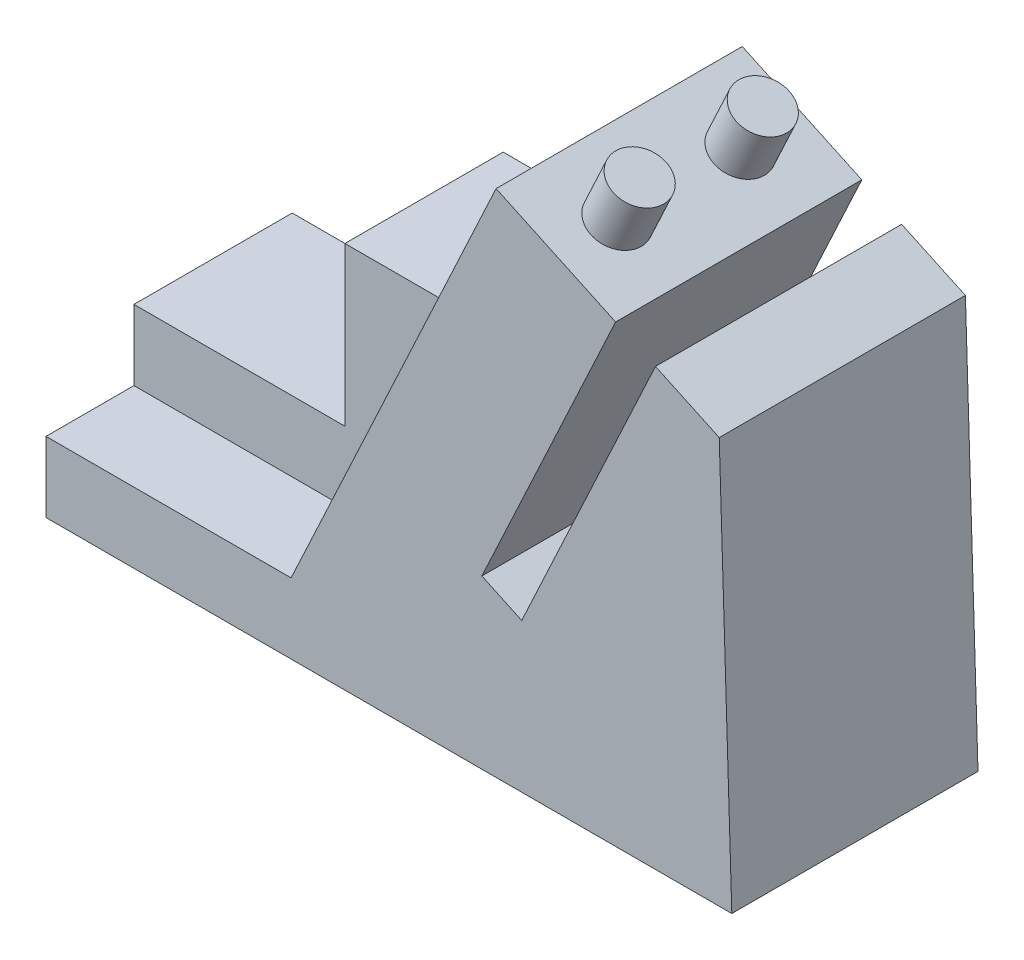
ISO-10303-21;
HEADER;
FILE_DESCRIPTION(('STEP AP214'),'2;1');
FILE_NAME('part.step','',(''),(''),'','','');
FILE_SCHEMA(('AUTOMOTIVE_DESIGN { 1 0 10303 214 1 1 1 1 }'));
ENDSEC;
DATA;
#1=APPLICATION_CONTEXT('core data for automotive mechanical design processes');
#2=APPLICATION_PROTOCOL_DEFINITION('international standard','automotive_design',2000,#1);
#3=PRODUCT_CONTEXT('',#1,'mechanical');
#4=PRODUCT('Part','Part','',(#3));
#5=PRODUCT_RELATED_PRODUCT_CATEGORY('part','',(#4));
#6=PRODUCT_DEFINITION_FORMATION('','',#4);
#7=PRODUCT_DEFINITION_CONTEXT('part definition',#1,'design');
#8=PRODUCT_DEFINITION('design','',#6,#7);
#9=PRODUCT_DEFINITION_SHAPE('','',#8);
#10=(LENGTH_UNIT() NAMED_UNIT(*) SI_UNIT(.MILLI.,.METRE.));
#11=(NAMED_UNIT(*) PLANE_ANGLE_UNIT() SI_UNIT($,.RADIAN.));
#12=(NAMED_UNIT(*) SI_UNIT($,.STERADIAN.) SOLID_ANGLE_UNIT());
#13=UNCERTAINTY_MEASURE_WITH_UNIT(LENGTH_MEASURE(1.E-05),#10,'distance_accuracy_value','');
#14=(GEOMETRIC_REPRESENTATION_CONTEXT(3) GLOBAL_UNCERTAINTY_ASSIGNED_CONTEXT((#13)) GLOBAL_UNIT_ASSIGNED_CONTEXT((#10,
#11,#12)) REPRESENTATION_CONTEXT('',''));
#15=CARTESIAN_POINT('',(0.,0.,0.));
#16=DIRECTION('',(0.,0.,1.));
#17=DIRECTION('',(1.,0.,0.));
#18=AXIS2_PLACEMENT_3D('',#15,#16,#17);
#19=CARTESIAN_POINT('',(27.8760008879699,8.,28.));
#20=DIRECTION('',(0.,-1.,0.));
#21=DIRECTION('',(1.,0.,0.));
#22=AXIS2_PLACEMENT_3D('',#19,#20,#21);
#23=PLANE('',#22);
#24=DIRECTION('',(0.,0.,-1.));
#25=VECTOR('',#24,1.);
#26=CARTESIAN_POINT('',(27.8760008879699,8.,28.));
#27=LINE('',#26,#25);
#28=CARTESIAN_POINT('',(27.8760008879699,8.,28.));
#29=VERTEX_POINT('',#28);
#30=CARTESIAN_POINT('',(27.8760008879699,8.,18.));
#31=VERTEX_POINT('',#30);
#32=EDGE_CURVE('E213',#29,#31,#27,.T.);
#33=ORIENTED_EDGE('',*,*,#32,.T.);
#34=DIRECTION('',(-1.,0.,0.));
#35=VECTOR('',#34,1.);
#36=CARTESIAN_POINT('',(0.,8.,18.));
#37=LINE('',#36,#35);
#38=CARTESIAN_POINT('',(0.,8.,18.));
#39=VERTEX_POINT('',#38);
#40=EDGE_CURVE('E59',#31,#39,#37,.T.);
#41=ORIENTED_EDGE('',*,*,#40,.T.);
#42=DIRECTION('',(0.,0.,-1.));
#43=VECTOR('',#42,1.);
#44=CARTESIAN_POINT('',(0.,8.,28.));
#45=LINE('',#44,#43);
#46=CARTESIAN_POINT('',(0.,8.,28.));
#47=VERTEX_POINT('',#46);
#48=EDGE_CURVE('E255',#47,#39,#45,.T.);
#49=ORIENTED_EDGE('',*,*,#48,.F.);
#50=DIRECTION('',(-1.,0.,0.));
#51=VECTOR('',#50,1.);
#52=CARTESIAN_POINT('',(27.8760008879699,8.,28.));
#53=LINE('',#52,#51);
#54=EDGE_CURVE('E191',#29,#47,#53,.T.);
#55=ORIENTED_EDGE('',*,*,#54,.F.);
#56=EDGE_LOOP('',(#33,#41,#49,#55));
#57=FACE_BOUND('',#56,.T.);
#58=ADVANCED_FACE('F45',(#57),#23,.F.);
#59=CARTESIAN_POINT('',(0.,8.,28.));
#60=DIRECTION('',(1.,0.,0.));
#61=DIRECTION('',(0.,0.,-1.));
#62=AXIS2_PLACEMENT_3D('',#59,#60,#61);
#63=PLANE('',#62);
#64=DIRECTION('',(0.,-1.,0.));
#65=VECTOR('',#64,1.);
#66=CARTESIAN_POINT('',(0.,8.,0.));
#67=LINE('',#66,#65);
#68=CARTESIAN_POINT('',(0.,16.,0.));
#69=VERTEX_POINT('',#68);
#70=CARTESIAN_POINT('',(0.,0.,0.));
#71=VERTEX_POINT('',#70);
#72=EDGE_CURVE('E157',#69,#71,#67,.T.);
#73=ORIENTED_EDGE('',*,*,#72,.T.);
#74=DIRECTION('',(0.,0.,-1.));
#75=VECTOR('',#74,1.);
#76=CARTESIAN_POINT('',(0.,0.,28.));
#77=LINE('',#76,#75);
#78=CARTESIAN_POINT('',(0.,0.,28.));
#79=VERTEX_POINT('',#78);
#80=EDGE_CURVE('E252',#79,#71,#77,.T.);
#81=ORIENTED_EDGE('',*,*,#80,.F.);
#82=DIRECTION('',(0.,-1.,0.));
#83=VECTOR('',#82,1.);
#84=CARTESIAN_POINT('',(0.,8.,28.));
#85=LINE('',#84,#83);
#86=EDGE_CURVE('E194',#47,#79,#85,.T.);
#87=ORIENTED_EDGE('',*,*,#86,.F.);
#88=ORIENTED_EDGE('',*,*,#48,.T.);
#89=DIRECTION('',(0.,1.,0.));
#90=VECTOR('',#89,1.);
#91=CARTESIAN_POINT('',(0.,0.,18.));
#92=LINE('',#91,#90);
#93=CARTESIAN_POINT('',(0.,16.,18.));
#94=VERTEX_POINT('',#93);
#95=EDGE_CURVE('E172',#39,#94,#92,.T.);
#96=ORIENTED_EDGE('',*,*,#95,.T.);
#97=DIRECTION('',(0.,0.,-1.));
#98=VECTOR('',#97,1.);
#99=CARTESIAN_POINT('',(0.,16.,18.));
#100=LINE('',#99,#98);
#101=EDGE_CURVE('E187',#94,#69,#100,.T.);
#102=ORIENTED_EDGE('',*,*,#101,.T.);
#103=EDGE_LOOP('',(#73,#81,#87,#88,#96,#102));
#104=FACE_BOUND('',#103,.T.);
#105=ADVANCED_FACE('F284',(#104),#63,.F.);
#106=CARTESIAN_POINT('',(0.,0.,28.));
#107=DIRECTION('',(0.,1.,0.));
#108=DIRECTION('',(0.,0.,1.));
#109=AXIS2_PLACEMENT_3D('',#106,#107,#108);
#110=PLANE('',#109);
#111=DIRECTION('',(1.,0.,0.));
#112=VECTOR('',#111,1.);
#113=CARTESIAN_POINT('',(0.,0.,0.));
#114=LINE('',#113,#112);
#115=CARTESIAN_POINT('',(78.,0.,0.));
#116=VERTEX_POINT('',#115);
#117=EDGE_CURVE('E215',#71,#116,#114,.T.);
#118=ORIENTED_EDGE('',*,*,#117,.T.);
#119=DIRECTION('',(0.,0.,-1.));
#120=VECTOR('',#119,1.);
#121=CARTESIAN_POINT('',(78.,0.,28.));
#122=LINE('',#121,#120);
#123=CARTESIAN_POINT('',(78.,0.,28.));
#124=VERTEX_POINT('',#123);
#125=EDGE_CURVE('E249',#124,#116,#122,.T.);
#126=ORIENTED_EDGE('',*,*,#125,.F.);
#127=DIRECTION('',(1.,0.,0.));
#128=VECTOR('',#127,1.);
#129=CARTESIAN_POINT('',(0.,0.,28.));
#130=LINE('',#129,#128);
#131=EDGE_CURVE('E197',#79,#124,#130,.T.);
#132=ORIENTED_EDGE('',*,*,#131,.F.);
#133=ORIENTED_EDGE('',*,*,#80,.T.);
#134=EDGE_LOOP('',(#118,#126,#132,#133));
#135=FACE_BOUND('',#134,.T.);
#136=ADVANCED_FACE('F314',(#135),#110,.F.);
#137=CARTESIAN_POINT('',(78.,0.,28.));
#138=DIRECTION('',(-0.999519288807426,-0.03100308536094,0.));
#139=DIRECTION('',(0.03100308536094,-0.999519288807426,0.));
#140=AXIS2_PLACEMENT_3D('',#137,#138,#139);
#141=PLANE('',#140);
#142=DIRECTION('',(-0.03100308536094,0.999519288807426,0.));
#143=VECTOR('',#142,1.);
#144=CARTESIAN_POINT('',(78.,0.,0.));
#145=LINE('',#144,#143);
#146=CARTESIAN_POINT('',(76.5680018327462,46.1666886712603,0.));
#147=VERTEX_POINT('',#146);
#148=EDGE_CURVE('E217',#116,#147,#145,.T.);
#149=ORIENTED_EDGE('',*,*,#148,.T.);
#150=DIRECTION('',(0.,0.,-1.));
#151=VECTOR('',#150,1.);
#152=CARTESIAN_POINT('',(76.5680018327462,46.1666886712603,28.));
#153=LINE('',#152,#151);
#154=CARTESIAN_POINT('',(76.5680018327462,46.1666886712603,28.));
#155=VERTEX_POINT('',#154);
#156=EDGE_CURVE('E246',#155,#147,#153,.T.);
#157=ORIENTED_EDGE('',*,*,#156,.F.);
#158=DIRECTION('',(-0.03100308536094,0.999519288807426,0.));
#159=VECTOR('',#158,1.);
#160=CARTESIAN_POINT('',(78.,0.,28.));
#161=LINE('',#160,#159);
#162=EDGE_CURVE('E199',#124,#155,#161,.T.);
#163=ORIENTED_EDGE('',*,*,#162,.F.);
#164=ORIENTED_EDGE('',*,*,#125,.T.);
#165=EDGE_LOOP('',(#149,#157,#163,#164));
#166=FACE_BOUND('',#165,.T.);
#167=ADVANCED_FACE('F309',(#166),#141,.F.);
#168=CARTESIAN_POINT('',(76.5680018327462,46.1666886712603,28.));
#169=DIRECTION('',(-0.422618261740703,-0.906307787036648,0.));
#170=DIRECTION('',(0.906307787036648,-0.422618261740703,0.));
#171=AXIS2_PLACEMENT_3D('',#168,#169,#170);
#172=PLANE('',#171);
#173=DIRECTION('',(-0.906307787036648,0.422618261740703,0.));
#174=VECTOR('',#173,1.);
#175=CARTESIAN_POINT('',(76.5680018327462,46.1666886712603,0.));
#176=LINE('',#175,#174);
#177=CARTESIAN_POINT('',(69.3175395364531,49.5476347651859,0.));
#178=VERTEX_POINT('',#177);
#179=EDGE_CURVE('E219',#147,#178,#176,.T.);
#180=ORIENTED_EDGE('',*,*,#179,.T.);
#181=DIRECTION('',(0.,0.,-1.));
#182=VECTOR('',#181,1.);
#183=CARTESIAN_POINT('',(69.3175395364531,49.5476347651859,28.));
#184=LINE('',#183,#182);
#185=CARTESIAN_POINT('',(69.3175395364531,49.5476347651859,28.));
#186=VERTEX_POINT('',#185);
#187=EDGE_CURVE('E243',#186,#178,#184,.T.);
#188=ORIENTED_EDGE('',*,*,#187,.F.);
#189=DIRECTION('',(-0.906307787036648,0.422618261740703,0.));
#190=VECTOR('',#189,1.);
#191=CARTESIAN_POINT('',(76.5680018327462,46.1666886712603,28.));
#192=LINE('',#191,#190);
#193=EDGE_CURVE('E201',#155,#186,#192,.T.);
#194=ORIENTED_EDGE('',*,*,#193,.F.);
#195=ORIENTED_EDGE('',*,*,#156,.T.);
#196=EDGE_LOOP('',(#180,#188,#194,#195));
#197=FACE_BOUND('',#196,.T.);
#198=ADVANCED_FACE('F305',(#197),#172,.F.);
#199=CARTESIAN_POINT('',(69.3175395364531,49.5476347651859,28.));
#200=DIRECTION('',(0.906307787036648,-0.422618261740704,0.));
#201=DIRECTION('',(0.422618261740704,0.906307787036648,0.));
#202=AXIS2_PLACEMENT_3D('',#199,#200,#201);
#203=PLANE('',#202);
#204=DIRECTION('',(-0.422618261740704,-0.906307787036648,0.));
#205=VECTOR('',#204,1.);
#206=CARTESIAN_POINT('',(69.3175395364531,49.5476347651859,0.));
#207=LINE('',#206,#205);
#208=CARTESIAN_POINT('',(54.1032821137877,16.9205544318666,0.));
#209=VERTEX_POINT('',#208);
#210=EDGE_CURVE('E221',#178,#209,#207,.T.);
#211=ORIENTED_EDGE('',*,*,#210,.T.);
#212=DIRECTION('',(0.,0.,-1.));
#213=VECTOR('',#212,1.);
#214=CARTESIAN_POINT('',(54.1032821137877,16.9205544318666,28.));
#215=LINE('',#214,#213);
#216=CARTESIAN_POINT('',(54.1032821137877,16.9205544318666,28.));
#217=VERTEX_POINT('',#216);
#218=EDGE_CURVE('E240',#217,#209,#215,.T.);
#219=ORIENTED_EDGE('',*,*,#218,.F.);
#220=DIRECTION('',(-0.422618261740704,-0.906307787036648,0.));
#221=VECTOR('',#220,1.);
#222=CARTESIAN_POINT('',(69.3175395364531,49.5476347651859,28.));
#223=LINE('',#222,#221);
#224=EDGE_CURVE('E203',#186,#217,#223,.T.);
#225=ORIENTED_EDGE('',*,*,#224,.F.);
#226=ORIENTED_EDGE('',*,*,#187,.T.);
#227=EDGE_LOOP('',(#211,#219,#225,#226));
#228=FACE_BOUND('',#227,.T.);
#229=ADVANCED_FACE('F301',(#228),#203,.F.);
#230=CARTESIAN_POINT('',(54.1032821137877,16.9205544318666,28.));
#231=DIRECTION('',(-0.422618261740704,-0.906307787036648,0.));
#232=DIRECTION('',(0.906307787036648,-0.422618261740704,0.));
#233=AXIS2_PLACEMENT_3D('',#230,#231,#232);
#234=PLANE('',#233);
#235=DIRECTION('',(-0.906307787036648,0.422618261740704,0.));
#236=VECTOR('',#235,1.);
#237=CARTESIAN_POINT('',(54.1032821137877,16.9205544318666,0.));
#238=LINE('',#237,#236);
#239=CARTESIAN_POINT('',(49.5717431786045,19.0336457405701,0.));
#240=VERTEX_POINT('',#239);
#241=EDGE_CURVE('E223',#209,#240,#238,.T.);
#242=ORIENTED_EDGE('',*,*,#241,.T.);
#243=DIRECTION('',(0.,0.,-1.));
#244=VECTOR('',#243,1.);
#245=CARTESIAN_POINT('',(49.5717431786045,19.0336457405701,28.));
#246=LINE('',#245,#244);
#247=CARTESIAN_POINT('',(49.5717431786045,19.0336457405701,28.));
#248=VERTEX_POINT('',#247);
#249=EDGE_CURVE('E237',#248,#240,#246,.T.);
#250=ORIENTED_EDGE('',*,*,#249,.F.);
#251=DIRECTION('',(-0.906307787036648,0.422618261740704,0.));
#252=VECTOR('',#251,1.);
#253=CARTESIAN_POINT('',(54.1032821137877,16.9205544318666,28.));
#254=LINE('',#253,#252);
#255=EDGE_CURVE('E205',#217,#248,#254,.T.);
#256=ORIENTED_EDGE('',*,*,#255,.F.);
#257=ORIENTED_EDGE('',*,*,#218,.T.);
#258=EDGE_LOOP('',(#242,#250,#256,#257));
#259=FACE_BOUND('',#258,.T.);
#260=ADVANCED_FACE('F297',(#259),#234,.F.);
#261=CARTESIAN_POINT('',(49.5717431786045,19.0336457405701,28.));
#262=DIRECTION('',(-0.906307787036648,0.422618261740703,0.));
#263=DIRECTION('',(-0.422618261740703,-0.906307787036648,0.));
#264=AXIS2_PLACEMENT_3D('',#261,#262,#263);
#265=PLANE('',#264);
#266=DIRECTION('',(0.422618261740703,0.906307787036648,0.));
#267=VECTOR('',#266,1.);
#268=CARTESIAN_POINT('',(49.5717431786045,19.0336457405701,0.));
#269=LINE('',#268,#267);
#270=CARTESIAN_POINT('',(64.7860006012698,51.6607260738894,0.));
#271=VERTEX_POINT('',#270);
#272=EDGE_CURVE('E225',#240,#271,#269,.T.);
#273=ORIENTED_EDGE('',*,*,#272,.T.);
#274=DIRECTION('',(0.,0.,-1.));
#275=VECTOR('',#274,1.);
#276=CARTESIAN_POINT('',(64.7860006012698,51.6607260738894,28.));
#277=LINE('',#276,#275);
#278=CARTESIAN_POINT('',(64.7860006012698,51.6607260738894,28.));
#279=VERTEX_POINT('',#278);
#280=EDGE_CURVE('E234',#279,#271,#277,.T.);
#281=ORIENTED_EDGE('',*,*,#280,.F.);
#282=DIRECTION('',(0.422618261740703,0.906307787036648,0.));
#283=VECTOR('',#282,1.);
#284=CARTESIAN_POINT('',(49.5717431786045,19.0336457405701,28.));
#285=LINE('',#284,#283);
#286=EDGE_CURVE('E207',#248,#279,#285,.T.);
#287=ORIENTED_EDGE('',*,*,#286,.F.);
#288=ORIENTED_EDGE('',*,*,#249,.T.);
#289=EDGE_LOOP('',(#273,#281,#287,#288));
#290=FACE_BOUND('',#289,.T.);
#291=ADVANCED_FACE('F265',(#290),#265,.F.);
#292=CARTESIAN_POINT('',(64.7860006012698,51.6607260738894,28.));
#293=DIRECTION('',(-0.422618261740704,-0.906307787036648,0.));
#294=DIRECTION('',(0.906307787036648,-0.422618261740704,0.));
#295=AXIS2_PLACEMENT_3D('',#292,#293,#294);
#296=PLANE('',#295);
#297=CARTESIAN_POINT('',(57.988692198495,54.8303630369447,21.));
#298=DIRECTION('',(-0.422618261740704,-0.906307787036648,0.));
#299=DIRECTION('',(0.906307787036648,-0.422618261740704,0.));
#300=AXIS2_PLACEMENT_3D('',#297,#298,#299);
#301=CIRCLE('',#300,3.);
#302=CARTESIAN_POINT('',(60.707615559605,53.5625082517226,21.));
#303=VERTEX_POINT('',#302);
#304=EDGE_CURVE('E11',#303,#303,#301,.F.);
#305=ORIENTED_EDGE('',*,*,#304,.F.);
#306=EDGE_LOOP('',(#305));
#307=FACE_BOUND('',#306,.T.);
#308=CARTESIAN_POINT('',(57.988692198495,54.8303630369447,7.));
#309=DIRECTION('',(-0.422618261740704,-0.906307787036648,0.));
#310=DIRECTION('',(0.906307787036648,-0.422618261740704,0.));
#311=AXIS2_PLACEMENT_3D('',#308,#309,#310);
#312=CIRCLE('',#311,3.);
#313=CARTESIAN_POINT('',(60.707615559605,53.5625082517226,7.));
#314=VERTEX_POINT('',#313);
#315=EDGE_CURVE('E52',#314,#314,#312,.F.);
#316=ORIENTED_EDGE('',*,*,#315,.F.);
#317=EDGE_LOOP('',(#316));
#318=FACE_BOUND('',#317,.T.);
#319=DIRECTION('',(-0.906307787036648,0.422618261740704,0.));
#320=VECTOR('',#319,1.);
#321=CARTESIAN_POINT('',(64.7860006012698,51.6607260738894,0.));
#322=LINE('',#321,#320);
#323=CARTESIAN_POINT('',(51.1913837957201,58.,0.));
#324=VERTEX_POINT('',#323);
#325=EDGE_CURVE('E227',#271,#324,#322,.T.);
#326=ORIENTED_EDGE('',*,*,#325,.T.);
#327=DIRECTION('',(0.,0.,-1.));
#328=VECTOR('',#327,1.);
#329=CARTESIAN_POINT('',(51.1913837957201,58.,28.));
#330=LINE('',#329,#328);
#331=CARTESIAN_POINT('',(51.1913837957201,58.,28.));
#332=VERTEX_POINT('',#331);
#333=EDGE_CURVE('E231',#332,#324,#330,.T.);
#334=ORIENTED_EDGE('',*,*,#333,.F.);
#335=DIRECTION('',(-0.906307787036648,0.422618261740704,0.));
#336=VECTOR('',#335,1.);
#337=CARTESIAN_POINT('',(64.7860006012698,51.6607260738894,28.));
#338=LINE('',#337,#336);
#339=EDGE_CURVE('E209',#279,#332,#338,.T.);
#340=ORIENTED_EDGE('',*,*,#339,.F.);
#341=ORIENTED_EDGE('',*,*,#280,.T.);
#342=EDGE_LOOP('',(#326,#334,#340,#341));
#343=FACE_BOUND('',#342,.T.);
#344=ADVANCED_FACE('F261',(#307,#318,#343),#296,.F.);
#345=CARTESIAN_POINT('',(51.1913837957201,58.,28.));
#346=DIRECTION('',(0.906307787036648,-0.422618261740704,0.));
#347=DIRECTION('',(0.422618261740704,0.906307787036648,0.));
#348=AXIS2_PLACEMENT_3D('',#345,#346,#347);
#349=PLANE('',#348);
#350=DIRECTION('',(-0.422618261740704,-0.906307787036648,0.));
#351=VECTOR('',#350,1.);
#352=CARTESIAN_POINT('',(51.1913837957201,58.,0.));
#353=LINE('',#352,#351);
#354=CARTESIAN_POINT('',(40.,34.,0.));
#355=VERTEX_POINT('',#354);
#356=EDGE_CURVE('E195',#324,#355,#353,.T.);
#357=ORIENTED_EDGE('',*,*,#356,.T.);
#358=DIRECTION('',(0.,0.,-1.));
#359=VECTOR('',#358,1.);
#360=CARTESIAN_POINT('',(40.,34.,18.));
#361=LINE('',#360,#359);
#362=CARTESIAN_POINT('',(40.,34.,18.));
#363=VERTEX_POINT('',#362);
#364=EDGE_CURVE('E67',#363,#355,#361,.T.);
#365=ORIENTED_EDGE('',*,*,#364,.F.);
#366=DIRECTION('',(-0.422618261740704,-0.906307787036648,0.));
#367=VECTOR('',#366,1.);
#368=CARTESIAN_POINT('',(19.8329966607079,-9.24827822705073,18.));
#369=LINE('',#368,#367);
#370=EDGE_CURVE('E166',#363,#31,#369,.T.);
#371=ORIENTED_EDGE('',*,*,#370,.T.);
#372=ORIENTED_EDGE('',*,*,#32,.F.);
#373=DIRECTION('',(-0.422618261740704,-0.906307787036648,0.));
#374=VECTOR('',#373,1.);
#375=CARTESIAN_POINT('',(51.1913837957201,58.,28.));
#376=LINE('',#375,#374);
#377=EDGE_CURVE('E211',#332,#29,#376,.T.);
#378=ORIENTED_EDGE('',*,*,#377,.F.);
#379=ORIENTED_EDGE('',*,*,#333,.T.);
#380=EDGE_LOOP('',(#357,#365,#371,#372,#378,#379));
#381=FACE_BOUND('',#380,.T.);
#382=ADVANCED_FACE('F264',(#381),#349,.F.);
#383=CARTESIAN_POINT('',(0.,0.,28.));
#384=DIRECTION('',(0.,0.,1.));
#385=DIRECTION('',(1.,0.,0.));
#386=AXIS2_PLACEMENT_3D('',#383,#384,#385);
#387=PLANE('',#386);
#388=ORIENTED_EDGE('',*,*,#54,.T.);
#389=ORIENTED_EDGE('',*,*,#86,.T.);
#390=ORIENTED_EDGE('',*,*,#131,.T.);
#391=ORIENTED_EDGE('',*,*,#162,.T.);
#392=ORIENTED_EDGE('',*,*,#193,.T.);
#393=ORIENTED_EDGE('',*,*,#224,.T.);
#394=ORIENTED_EDGE('',*,*,#255,.T.);
#395=ORIENTED_EDGE('',*,*,#286,.T.);
#396=ORIENTED_EDGE('',*,*,#339,.T.);
#397=ORIENTED_EDGE('',*,*,#377,.T.);
#398=EDGE_LOOP('',(#388,#389,#390,#391,#392,#393,#394,#395,#396,#397));
#399=FACE_BOUND('',#398,.T.);
#400=ADVANCED_FACE('F288',(#399),#387,.T.);
#401=CARTESIAN_POINT('',(0.,0.,0.));
#402=DIRECTION('',(0.,0.,1.));
#403=DIRECTION('',(1.,0.,0.));
#404=AXIS2_PLACEMENT_3D('',#401,#402,#403);
#405=PLANE('',#404);
#406=ORIENTED_EDGE('',*,*,#72,.F.);
#407=DIRECTION('',(1.,0.,0.));
#408=VECTOR('',#407,1.);
#409=CARTESIAN_POINT('',(0.,16.,0.));
#410=LINE('',#409,#408);
#411=CARTESIAN_POINT('',(24.,16.,0.));
#412=VERTEX_POINT('',#411);
#413=EDGE_CURVE('E167',#69,#412,#410,.T.);
#414=ORIENTED_EDGE('',*,*,#413,.T.);
#415=DIRECTION('',(0.,1.,0.));
#416=VECTOR('',#415,1.);
#417=CARTESIAN_POINT('',(24.,0.,0.));
#418=LINE('',#417,#416);
#419=CARTESIAN_POINT('',(24.,34.,0.));
#420=VERTEX_POINT('',#419);
#421=EDGE_CURVE('E181',#412,#420,#418,.T.);
#422=ORIENTED_EDGE('',*,*,#421,.T.);
#423=DIRECTION('',(1.,0.,0.));
#424=VECTOR('',#423,1.);
#425=CARTESIAN_POINT('',(0.,34.,0.));
#426=LINE('',#425,#424);
#427=EDGE_CURVE('E152',#420,#355,#426,.T.);
#428=ORIENTED_EDGE('',*,*,#427,.T.);
#429=ORIENTED_EDGE('',*,*,#356,.F.);
#430=ORIENTED_EDGE('',*,*,#325,.F.);
#431=ORIENTED_EDGE('',*,*,#272,.F.);
#432=ORIENTED_EDGE('',*,*,#241,.F.);
#433=ORIENTED_EDGE('',*,*,#210,.F.);
#434=ORIENTED_EDGE('',*,*,#179,.F.);
#435=ORIENTED_EDGE('',*,*,#148,.F.);
#436=ORIENTED_EDGE('',*,*,#117,.F.);
#437=EDGE_LOOP('',(#406,#414,#422,#428,#429,#430,#431,#432,#433,#434,#435,#436));
#438=FACE_BOUND('',#437,.T.);
#439=ADVANCED_FACE('F277',(#438),#405,.F.);
#440=CARTESIAN_POINT('',(0.,34.,18.));
#441=DIRECTION('',(0.,1.,0.));
#442=DIRECTION('',(0.,0.,1.));
#443=AXIS2_PLACEMENT_3D('',#440,#441,#442);
#444=PLANE('',#443);
#445=ORIENTED_EDGE('',*,*,#427,.F.);
#446=DIRECTION('',(0.,0.,-1.));
#447=VECTOR('',#446,1.);
#448=CARTESIAN_POINT('',(24.,34.,18.));
#449=LINE('',#448,#447);
#450=CARTESIAN_POINT('',(24.,34.,18.));
#451=VERTEX_POINT('',#450);
#452=EDGE_CURVE('E146',#451,#420,#449,.T.);
#453=ORIENTED_EDGE('',*,*,#452,.F.);
#454=DIRECTION('',(1.,0.,0.));
#455=VECTOR('',#454,1.);
#456=CARTESIAN_POINT('',(0.,34.,18.));
#457=LINE('',#456,#455);
#458=EDGE_CURVE('E149',#451,#363,#457,.T.);
#459=ORIENTED_EDGE('',*,*,#458,.T.);
#460=ORIENTED_EDGE('',*,*,#364,.T.);
#461=EDGE_LOOP('',(#445,#453,#459,#460));
#462=FACE_BOUND('',#461,.T.);
#463=ADVANCED_FACE('F148',(#462),#444,.T.);
#464=CARTESIAN_POINT('',(24.,0.,18.));
#465=DIRECTION('',(-1.,0.,0.));
#466=DIRECTION('',(0.,0.,1.));
#467=AXIS2_PLACEMENT_3D('',#464,#465,#466);
#468=PLANE('',#467);
#469=ORIENTED_EDGE('',*,*,#421,.F.);
#470=DIRECTION('',(0.,0.,-1.));
#471=VECTOR('',#470,1.);
#472=CARTESIAN_POINT('',(24.,16.,18.));
#473=LINE('',#472,#471);
#474=CARTESIAN_POINT('',(24.,16.,18.));
#475=VERTEX_POINT('',#474);
#476=EDGE_CURVE('E158',#475,#412,#473,.T.);
#477=ORIENTED_EDGE('',*,*,#476,.F.);
#478=DIRECTION('',(0.,1.,0.));
#479=VECTOR('',#478,1.);
#480=CARTESIAN_POINT('',(24.,0.,18.));
#481=LINE('',#480,#479);
#482=EDGE_CURVE('E164',#475,#451,#481,.T.);
#483=ORIENTED_EDGE('',*,*,#482,.T.);
#484=ORIENTED_EDGE('',*,*,#452,.T.);
#485=EDGE_LOOP('',(#469,#477,#483,#484));
#486=FACE_BOUND('',#485,.T.);
#487=ADVANCED_FACE('F169',(#486),#468,.T.);
#488=CARTESIAN_POINT('',(0.,16.,18.));
#489=DIRECTION('',(0.,1.,0.));
#490=DIRECTION('',(0.,0.,1.));
#491=AXIS2_PLACEMENT_3D('',#488,#489,#490);
#492=PLANE('',#491);
#493=ORIENTED_EDGE('',*,*,#413,.F.);
#494=ORIENTED_EDGE('',*,*,#101,.F.);
#495=DIRECTION('',(1.,0.,0.));
#496=VECTOR('',#495,1.);
#497=CARTESIAN_POINT('',(0.,16.,18.));
#498=LINE('',#497,#496);
#499=EDGE_CURVE('E170',#94,#475,#498,.T.);
#500=ORIENTED_EDGE('',*,*,#499,.T.);
#501=ORIENTED_EDGE('',*,*,#476,.T.);
#502=EDGE_LOOP('',(#493,#494,#500,#501));
#503=FACE_BOUND('',#502,.T.);
#504=ADVANCED_FACE('F281',(#503),#492,.T.);
#505=CARTESIAN_POINT('',(0.,0.,18.));
#506=DIRECTION('',(0.,0.,1.));
#507=DIRECTION('',(1.,0.,0.));
#508=AXIS2_PLACEMENT_3D('',#505,#506,#507);
#509=PLANE('',#508);
#510=ORIENTED_EDGE('',*,*,#458,.F.);
#511=ORIENTED_EDGE('',*,*,#482,.F.);
#512=ORIENTED_EDGE('',*,*,#499,.F.);
#513=ORIENTED_EDGE('',*,*,#95,.F.);
#514=ORIENTED_EDGE('',*,*,#40,.F.);
#515=ORIENTED_EDGE('',*,*,#370,.F.);
#516=EDGE_LOOP('',(#510,#511,#512,#513,#514,#515));
#517=FACE_BOUND('',#516,.T.);
#518=ADVANCED_FACE('F162',(#517),#509,.T.);
#519=CARTESIAN_POINT('',(60.5244017689393,60.2682097591646,7.));
#520=DIRECTION('',(-0.422618261740703,-0.906307787036648,0.));
#521=DIRECTION('',(0.906307787036648,-0.422618261740703,0.));
#522=AXIS2_PLACEMENT_3D('',#519,#520,#521);
#523=CYLINDRICAL_SURFACE('',#522,3.);
#524=CARTESIAN_POINT('',(60.5244017689393,60.2682097591646,7.));
#525=DIRECTION('',(0.422618261740703,0.906307787036648,0.));
#526=DIRECTION('',(-0.906307787036648,0.422618261740703,0.));
#527=AXIS2_PLACEMENT_3D('',#524,#525,#526);
#528=CIRCLE('',#527,3.);
#529=CARTESIAN_POINT('',(63.2433251300492,59.0003549739425,7.));
#530=VERTEX_POINT('',#529);
#531=EDGE_CURVE('E182',#530,#530,#528,.T.);
#532=CARTESIAN_POINT('',(63.2433251300492,59.0003549739425,7.));
#533=CARTESIAN_POINT('',(63.2169114886904,58.9437107372527,7.));
#534=CARTESIAN_POINT('',(63.1904978473317,58.887066500563,7.));
#535=CARTESIAN_POINT('',(63.1376705646141,58.7737780271834,7.));
#536=CARTESIAN_POINT('',(63.1112569232553,58.7171337904936,7.));
#537=CARTESIAN_POINT('',(63.0584296405377,58.603845317114,7.));
#538=CARTESIAN_POINT('',(63.0320159991789,58.5472010804242,7.));
#539=CARTESIAN_POINT('',(62.9791887164613,58.4339126070446,7.));
#540=CARTESIAN_POINT('',(62.9527750751025,58.3772683703548,7.));
#541=CARTESIAN_POINT('',(62.8999477923849,58.2639798969753,7.));
#542=CARTESIAN_POINT('',(62.8735341510261,58.2073356602855,7.));
#543=CARTESIAN_POINT('',(62.8207068683085,58.0940471869059,7.));
#544=CARTESIAN_POINT('',(62.7942932269497,58.0374029502161,7.));
#545=CARTESIAN_POINT('',(62.7414659442321,57.9241144768365,7.));
#546=CARTESIAN_POINT('',(62.7150523028733,57.8674702401467,7.));
#547=CARTESIAN_POINT('',(62.6622250201558,57.7541817667671,7.));
#548=CARTESIAN_POINT('',(62.635811378797,57.6975375300773,7.));
#549=CARTESIAN_POINT('',(62.5829840960794,57.5842490566978,7.));
#550=CARTESIAN_POINT('',(62.5565704547206,57.527604820008,7.));
#551=CARTESIAN_POINT('',(62.503743172003,57.4143163466284,7.));
#552=CARTESIAN_POINT('',(62.4773295306442,57.3576721099386,7.));
#553=CARTESIAN_POINT('',(62.4245022479266,57.244383636559,7.));
#554=CARTESIAN_POINT('',(62.3980886065678,57.1877393998692,7.));
#555=CARTESIAN_POINT('',(62.3452613238502,57.0744509264896,7.));
#556=CARTESIAN_POINT('',(62.3188476824914,57.0178066897998,7.));
#557=CARTESIAN_POINT('',(62.2660203997738,56.9045182164203,7.));
#558=CARTESIAN_POINT('',(62.2396067584151,56.8478739797305,7.));
#559=CARTESIAN_POINT('',(62.1867794756975,56.7345855063509,7.));
#560=CARTESIAN_POINT('',(62.1603658343387,56.6779412696611,7.));
#561=CARTESIAN_POINT('',(62.1075385516211,56.5646527962815,7.));
#562=CARTESIAN_POINT('',(62.0811249102623,56.5080085595917,7.));
#563=CARTESIAN_POINT('',(62.0282976275447,56.3947200862121,7.));
#564=CARTESIAN_POINT('',(62.0018839861859,56.3380758495223,7.));
#565=CARTESIAN_POINT('',(61.9490567034683,56.2247873761428,7.));
#566=CARTESIAN_POINT('',(61.9226430621095,56.168143139453,7.));
#567=CARTESIAN_POINT('',(61.8698157793919,56.0548546660734,7.));
#568=CARTESIAN_POINT('',(61.8434021380331,55.9982104293836,7.));
#569=CARTESIAN_POINT('',(61.7905748553155,55.884921956004,7.));
#570=CARTESIAN_POINT('',(61.7641612139568,55.8282777193142,7.));
#571=CARTESIAN_POINT('',(61.7113339312392,55.7149892459346,7.));
#572=CARTESIAN_POINT('',(61.6849202898804,55.6583450092449,7.));
#573=CARTESIAN_POINT('',(61.6320930071628,55.5450565358653,7.));
#574=CARTESIAN_POINT('',(61.605679365804,55.4884122991755,7.));
#575=CARTESIAN_POINT('',(61.5528520830864,55.3751238257959,7.));
#576=CARTESIAN_POINT('',(61.5264384417276,55.3184795891061,7.));
#577=CARTESIAN_POINT('',(61.47361115901,55.2051911157265,7.));
#578=CARTESIAN_POINT('',(61.4471975176512,55.1485468790367,7.));
#579=CARTESIAN_POINT('',(61.3943702349336,55.0352584056572,7.));
#580=CARTESIAN_POINT('',(61.3679565935748,54.9786141689674,7.));
#581=CARTESIAN_POINT('',(61.3151293108573,54.8653256955878,7.));
#582=CARTESIAN_POINT('',(61.2887156694985,54.808681458898,7.));
#583=CARTESIAN_POINT('',(61.2358883867809,54.6953929855184,7.));
#584=CARTESIAN_POINT('',(61.2094747454221,54.6387487488286,7.));
#585=CARTESIAN_POINT('',(61.1566474627045,54.525460275449,7.));
#586=CARTESIAN_POINT('',(61.1302338213457,54.4688160387592,7.));
#587=CARTESIAN_POINT('',(61.0774065386281,54.3555275653797,7.));
#588=CARTESIAN_POINT('',(61.0509928972693,54.2988833286899,7.));
#589=CARTESIAN_POINT('',(60.9981656145517,54.1855948553103,7.));
#590=CARTESIAN_POINT('',(60.9717519731929,54.1289506186205,7.));
#591=CARTESIAN_POINT('',(60.9189246904753,54.0156621452409,7.));
#592=CARTESIAN_POINT('',(60.8925110491165,53.9590179085511,7.));
#593=CARTESIAN_POINT('',(60.839683766399,53.8457294351715,7.));
#594=CARTESIAN_POINT('',(60.8132701250402,53.7890851984817,7.));
#595=CARTESIAN_POINT('',(60.7604428423226,53.6757967251022,7.));
#596=CARTESIAN_POINT('',(60.7340292009638,53.6191524884124,7.));
#597=CARTESIAN_POINT('',(60.707615559605,53.5625082517226,7.));
#598=B_SPLINE_CURVE_WITH_KNOTS('',3,(#532,#533,#534,#535,#536,#537,#538,#539,#540,#541,#542,
#543,#544,#545,#546,#547,#548,#549,#550,#551,#552,#553,#554,#555,#556,#557,#558,#559,#560,#561,
#562,#563,#564,#565,#566,#567,#568,#569,#570,#571,#572,#573,#574,#575,#576,#577,#578,#579,#580,
#581,#582,#583,#584,#585,#586,#587,#588,#589,#590,#591,#592,#593,#594,#595,#596,#597),
.UNSPECIFIED.,.F.,.F.,(4,2,2,2,2,2,2,2,2,2,2,2,2,2,2,2,2,2,2,2,2,2,2,2,2,2,2,2,2,2,2,2,4),(0.,
0.187499999999997,0.375000000000005,0.562500000000008,0.750000000000005,0.937500000000008,
1.12500000000002,1.31250000000001,1.50000000000002,1.68750000000002,1.87500000000002,
2.06250000000002,2.25000000000003,2.43750000000003,2.62500000000003,2.81250000000004,
3.00000000000004,3.18750000000004,3.37500000000004,3.56250000000005,3.75000000000005,
3.93750000000005,4.12500000000005,4.31250000000005,4.50000000000006,4.68750000000006,
4.87500000000006,5.06250000000006,5.25000000000007,5.43750000000007,5.62500000000007,
5.81250000000007,6.00000000000007),.UNSPECIFIED.);
#599=EDGE_CURVE('BSEAM259',#530,#314,#598,.T.);
#600=ORIENTED_EDGE('',*,*,#531,.F.);
#601=ORIENTED_EDGE('',*,*,#315,.T.);
#602=ORIENTED_EDGE('',*,*,#599,.T.);
#603=ORIENTED_EDGE('',*,*,#599,.F.);
#604=EDGE_LOOP('',(#600,#602,#601,#603));
#605=FACE_BOUND('',#604,.T.);
#606=ADVANCED_FACE('F259',(#605),#523,.T.);
#607=CARTESIAN_POINT('',(60.5244017689393,60.2682097591646,7.));
#608=DIRECTION('',(0.422618261740703,0.906307787036648,0.));
#609=DIRECTION('',(-0.906307787036648,0.422618261740703,0.));
#610=AXIS2_PLACEMENT_3D('',#607,#608,#609);
#611=PLANE('',#610);
#612=ORIENTED_EDGE('',*,*,#531,.T.);
#613=EDGE_LOOP('',(#612));
#614=FACE_BOUND('',#613,.T.);
#615=ADVANCED_FACE('F442',(#614),#611,.T.);
#616=CARTESIAN_POINT('',(60.5244017689393,60.2682097591646,21.));
#617=DIRECTION('',(-0.422618261740703,-0.906307787036648,0.));
#618=DIRECTION('',(0.906307787036648,-0.422618261740703,0.));
#619=AXIS2_PLACEMENT_3D('',#616,#617,#618);
#620=CYLINDRICAL_SURFACE('',#619,3.);
#621=CARTESIAN_POINT('',(60.5244017689393,60.2682097591646,21.));
#622=DIRECTION('',(0.422618261740703,0.906307787036648,0.));
#623=DIRECTION('',(-0.906307787036648,0.422618261740703,0.));
#624=AXIS2_PLACEMENT_3D('',#621,#622,#623);
#625=CIRCLE('',#624,3.);
#626=CARTESIAN_POINT('',(63.2433251300492,59.0003549739425,21.));
#627=VERTEX_POINT('',#626);
#628=EDGE_CURVE('E566',#627,#627,#625,.T.);
#629=CARTESIAN_POINT('',(63.2433251300492,59.0003549739425,21.));
#630=CARTESIAN_POINT('',(63.2169114886904,58.9437107372527,21.));
#631=CARTESIAN_POINT('',(63.1904978473317,58.887066500563,21.));
#632=CARTESIAN_POINT('',(63.1376705646141,58.7737780271834,21.));
#633=CARTESIAN_POINT('',(63.1112569232553,58.7171337904936,21.));
#634=CARTESIAN_POINT('',(63.0584296405377,58.603845317114,21.));
#635=CARTESIAN_POINT('',(63.0320159991789,58.5472010804242,21.));
#636=CARTESIAN_POINT('',(62.9791887164613,58.4339126070446,21.));
#637=CARTESIAN_POINT('',(62.9527750751025,58.3772683703548,21.));
#638=CARTESIAN_POINT('',(62.8999477923849,58.2639798969753,21.));
#639=CARTESIAN_POINT('',(62.8735341510261,58.2073356602855,21.));
#640=CARTESIAN_POINT('',(62.8207068683085,58.0940471869059,21.));
#641=CARTESIAN_POINT('',(62.7942932269497,58.0374029502161,21.));
#642=CARTESIAN_POINT('',(62.7414659442321,57.9241144768365,21.));
#643=CARTESIAN_POINT('',(62.7150523028733,57.8674702401467,21.));
#644=CARTESIAN_POINT('',(62.6622250201558,57.7541817667671,21.));
#645=CARTESIAN_POINT('',(62.635811378797,57.6975375300773,21.));
#646=CARTESIAN_POINT('',(62.5829840960794,57.5842490566978,21.));
#647=CARTESIAN_POINT('',(62.5565704547206,57.527604820008,21.));
#648=CARTESIAN_POINT('',(62.503743172003,57.4143163466284,21.));
#649=CARTESIAN_POINT('',(62.4773295306442,57.3576721099386,21.));
#650=CARTESIAN_POINT('',(62.4245022479266,57.244383636559,21.));
#651=CARTESIAN_POINT('',(62.3980886065678,57.1877393998692,21.));
#652=CARTESIAN_POINT('',(62.3452613238502,57.0744509264896,21.));
#653=CARTESIAN_POINT('',(62.3188476824914,57.0178066897998,21.));
#654=CARTESIAN_POINT('',(62.2660203997738,56.9045182164203,21.));
#655=CARTESIAN_POINT('',(62.2396067584151,56.8478739797305,21.));
#656=CARTESIAN_POINT('',(62.1867794756975,56.7345855063509,21.));
#657=CARTESIAN_POINT('',(62.1603658343387,56.6779412696611,21.));
#658=CARTESIAN_POINT('',(62.1075385516211,56.5646527962815,21.));
#659=CARTESIAN_POINT('',(62.0811249102623,56.5080085595917,21.));
#660=CARTESIAN_POINT('',(62.0282976275447,56.3947200862121,21.));
#661=CARTESIAN_POINT('',(62.0018839861859,56.3380758495223,21.));
#662=CARTESIAN_POINT('',(61.9490567034683,56.2247873761428,21.));
#663=CARTESIAN_POINT('',(61.9226430621095,56.168143139453,21.));
#664=CARTESIAN_POINT('',(61.8698157793919,56.0548546660734,21.));
#665=CARTESIAN_POINT('',(61.8434021380331,55.9982104293836,21.));
#666=CARTESIAN_POINT('',(61.7905748553155,55.884921956004,21.));
#667=CARTESIAN_POINT('',(61.7641612139568,55.8282777193142,21.));
#668=CARTESIAN_POINT('',(61.7113339312392,55.7149892459346,21.));
#669=CARTESIAN_POINT('',(61.6849202898804,55.6583450092449,21.));
#670=CARTESIAN_POINT('',(61.6320930071628,55.5450565358653,21.));
#671=CARTESIAN_POINT('',(61.605679365804,55.4884122991755,21.));
#672=CARTESIAN_POINT('',(61.5528520830864,55.3751238257959,21.));
#673=CARTESIAN_POINT('',(61.5264384417276,55.3184795891061,21.));
#674=CARTESIAN_POINT('',(61.47361115901,55.2051911157265,21.));
#675=CARTESIAN_POINT('',(61.4471975176512,55.1485468790367,21.));
#676=CARTESIAN_POINT('',(61.3943702349336,55.0352584056572,21.));
#677=CARTESIAN_POINT('',(61.3679565935748,54.9786141689674,21.));
#678=CARTESIAN_POINT('',(61.3151293108573,54.8653256955878,21.));
#679=CARTESIAN_POINT('',(61.2887156694985,54.808681458898,21.));
#680=CARTESIAN_POINT('',(61.2358883867809,54.6953929855184,21.));
#681=CARTESIAN_POINT('',(61.2094747454221,54.6387487488286,21.));
#682=CARTESIAN_POINT('',(61.1566474627045,54.525460275449,21.));
#683=CARTESIAN_POINT('',(61.1302338213457,54.4688160387592,21.));
#684=CARTESIAN_POINT('',(61.0774065386281,54.3555275653797,21.));
#685=CARTESIAN_POINT('',(61.0509928972693,54.2988833286899,21.));
#686=CARTESIAN_POINT('',(60.9981656145517,54.1855948553103,21.));
#687=CARTESIAN_POINT('',(60.9717519731929,54.1289506186205,21.));
#688=CARTESIAN_POINT('',(60.9189246904753,54.0156621452409,21.));
#689=CARTESIAN_POINT('',(60.8925110491165,53.9590179085511,21.));
#690=CARTESIAN_POINT('',(60.839683766399,53.8457294351715,21.));
#691=CARTESIAN_POINT('',(60.8132701250402,53.7890851984817,21.));
#692=CARTESIAN_POINT('',(60.7604428423226,53.6757967251022,21.));
#693=CARTESIAN_POINT('',(60.7340292009638,53.6191524884124,21.));
#694=CARTESIAN_POINT('',(60.707615559605,53.5625082517226,21.));
#695=B_SPLINE_CURVE_WITH_KNOTS('',3,(#629,#630,#631,#632,#633,#634,#635,#636,#637,#638,#639,
#640,#641,#642,#643,#644,#645,#646,#647,#648,#649,#650,#651,#652,#653,#654,#655,#656,#657,#658,
#659,#660,#661,#662,#663,#664,#665,#666,#667,#668,#669,#670,#671,#672,#673,#674,#675,#676,#677,
#678,#679,#680,#681,#682,#683,#684,#685,#686,#687,#688,#689,#690,#691,#692,#693,#694),
.UNSPECIFIED.,.F.,.F.,(4,2,2,2,2,2,2,2,2,2,2,2,2,2,2,2,2,2,2,2,2,2,2,2,2,2,2,2,2,2,2,2,4),(0.,
0.187499999999997,0.375000000000005,0.562500000000008,0.750000000000005,0.937500000000008,
1.12500000000002,1.31250000000001,1.50000000000002,1.68750000000002,1.87500000000002,
2.06250000000002,2.25000000000003,2.43750000000003,2.62500000000003,2.81250000000004,
3.00000000000004,3.18750000000004,3.37500000000004,3.56250000000005,3.75000000000005,
3.93750000000005,4.12500000000005,4.31250000000005,4.50000000000006,4.68750000000006,
4.87500000000006,5.06250000000006,5.25000000000007,5.43750000000007,5.62500000000007,
5.81250000000007,6.00000000000007),.UNSPECIFIED.);
#696=EDGE_CURVE('BSEAM452',#627,#303,#695,.T.);
#697=ORIENTED_EDGE('',*,*,#628,.F.);
#698=ORIENTED_EDGE('',*,*,#304,.T.);
#699=ORIENTED_EDGE('',*,*,#696,.T.);
#700=ORIENTED_EDGE('',*,*,#696,.F.);
#701=EDGE_LOOP('',(#697,#699,#698,#700));
#702=FACE_BOUND('',#701,.T.);
#703=ADVANCED_FACE('F452',(#702),#620,.T.);
#704=CARTESIAN_POINT('',(60.5244017689393,60.2682097591646,21.));
#705=DIRECTION('',(0.422618261740703,0.906307787036648,0.));
#706=DIRECTION('',(-0.906307787036648,0.422618261740703,0.));
#707=AXIS2_PLACEMENT_3D('',#704,#705,#706);
#708=PLANE('',#707);
#709=ORIENTED_EDGE('',*,*,#628,.T.);
#710=EDGE_LOOP('',(#709));
#711=FACE_BOUND('',#710,.T.);
#712=ADVANCED_FACE('F462',(#711),#708,.T.);
#713=CLOSED_SHELL('',(#58,#105,#136,#167,#198,#229,#260,#291,#344,#382,#400,#439,#463,#487,#504,
#518,#606,#615,#703,#712));
#714=MANIFOLD_SOLID_BREP('B2',#713);
#715=ADVANCED_BREP_SHAPE_REPRESENTATION('',(#18,#714),#14);
#716=SHAPE_DEFINITION_REPRESENTATION(#9,#715);
ENDSEC;
END-ISO-10303-21;
